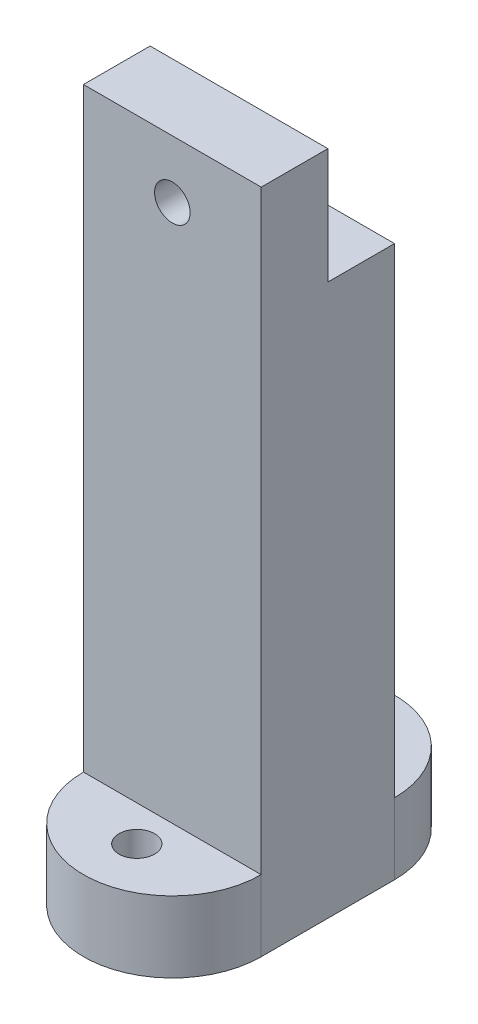
ISO-10303-21;
HEADER;
FILE_DESCRIPTION(('STEP AP214'),'2;1');
FILE_NAME('part.step','',(''),(''),'','','');
FILE_SCHEMA(('AUTOMOTIVE_DESIGN { 1 0 10303 214 1 1 1 1 }'));
ENDSEC;
DATA;
#1=APPLICATION_CONTEXT('core data for automotive mechanical design processes');
#2=APPLICATION_PROTOCOL_DEFINITION('international standard','automotive_design',2000,#1);
#3=PRODUCT_CONTEXT('',#1,'mechanical');
#4=PRODUCT('Part','Part','',(#3));
#5=PRODUCT_RELATED_PRODUCT_CATEGORY('part','',(#4));
#6=PRODUCT_DEFINITION_FORMATION('','',#4);
#7=PRODUCT_DEFINITION_CONTEXT('part definition',#1,'design');
#8=PRODUCT_DEFINITION('design','',#6,#7);
#9=PRODUCT_DEFINITION_SHAPE('','',#8);
#10=(LENGTH_UNIT() NAMED_UNIT(*) SI_UNIT(.MILLI.,.METRE.));
#11=(NAMED_UNIT(*) PLANE_ANGLE_UNIT() SI_UNIT($,.RADIAN.));
#12=(NAMED_UNIT(*) SI_UNIT($,.STERADIAN.) SOLID_ANGLE_UNIT());
#13=UNCERTAINTY_MEASURE_WITH_UNIT(LENGTH_MEASURE(1.E-05),#10,'distance_accuracy_value','');
#14=(GEOMETRIC_REPRESENTATION_CONTEXT(3) GLOBAL_UNCERTAINTY_ASSIGNED_CONTEXT((#13)) GLOBAL_UNIT_ASSIGNED_CONTEXT((#10,
#11,#12)) REPRESENTATION_CONTEXT('',''));
#15=CARTESIAN_POINT('',(0.,0.,0.));
#16=DIRECTION('',(0.,0.,1.));
#17=DIRECTION('',(1.,0.,0.));
#18=AXIS2_PLACEMENT_3D('',#15,#16,#17);
#19=CARTESIAN_POINT('',(0.,0.,0.));
#20=DIRECTION('',(0.,0.,1.));
#21=DIRECTION('',(1.,0.,0.));
#22=AXIS2_PLACEMENT_3D('',#19,#20,#21);
#23=PLANE('',#22);
#24=DIRECTION('',(0.,-1.,0.));
#25=VECTOR('',#24,1.);
#26=CARTESIAN_POINT('',(-10.,37.5,0.));
#27=LINE('',#26,#25);
#28=CARTESIAN_POINT('',(-10.,24.5,0.));
#29=VERTEX_POINT('',#28);
#30=CARTESIAN_POINT('',(-10.,-29.5,0.));
#31=VERTEX_POINT('',#30);
#32=EDGE_CURVE('E125',#29,#31,#27,.T.);
#33=ORIENTED_EDGE('',*,*,#32,.F.);
#34=DIRECTION('',(-1.,0.,0.));
#35=VECTOR('',#34,1.);
#36=CARTESIAN_POINT('',(10.,24.5,0.));
#37=LINE('',#36,#35);
#38=CARTESIAN_POINT('',(10.,24.5,0.));
#39=VERTEX_POINT('',#38);
#40=EDGE_CURVE('E60',#39,#29,#37,.T.);
#41=ORIENTED_EDGE('',*,*,#40,.F.);
#42=DIRECTION('',(0.,1.,0.));
#43=VECTOR('',#42,1.);
#44=CARTESIAN_POINT('',(9.99999999999999,37.5,0.));
#45=LINE('',#44,#43);
#46=CARTESIAN_POINT('',(10.,-29.5,0.));
#47=VERTEX_POINT('',#46);
#48=EDGE_CURVE('E123',#47,#39,#45,.T.);
#49=ORIENTED_EDGE('',*,*,#48,.F.);
#50=DIRECTION('',(-1.,0.,0.));
#51=VECTOR('',#50,1.);
#52=CARTESIAN_POINT('',(-10.,-29.5,0.));
#53=LINE('',#52,#51);
#54=EDGE_CURVE('E134',#47,#31,#53,.T.);
#55=ORIENTED_EDGE('',*,*,#54,.T.);
#56=EDGE_LOOP('',(#33,#41,#49,#55));
#57=FACE_BOUND('',#56,.T.);
#58=ADVANCED_FACE('F45',(#57),#23,.F.);
#59=CARTESIAN_POINT('',(9.99999999999999,37.5,15.));
#60=DIRECTION('',(-1.,0.,0.));
#61=DIRECTION('',(0.,-1.,0.));
#62=AXIS2_PLACEMENT_3D('',#59,#60,#61);
#63=PLANE('',#62);
#64=DIRECTION('',(0.,0.,-1.));
#65=VECTOR('',#64,1.);
#66=CARTESIAN_POINT('',(10.,24.5,0.));
#67=LINE('',#66,#65);
#68=CARTESIAN_POINT('',(10.,24.5,7.5));
#69=VERTEX_POINT('',#68);
#70=EDGE_CURVE('E110',#69,#39,#67,.T.);
#71=ORIENTED_EDGE('',*,*,#70,.F.);
#72=DIRECTION('',(0.,1.,0.));
#73=VECTOR('',#72,1.);
#74=CARTESIAN_POINT('',(10.,24.5,7.5));
#75=LINE('',#74,#73);
#76=CARTESIAN_POINT('',(10.,37.5,7.5));
#77=VERTEX_POINT('',#76);
#78=EDGE_CURVE('E166',#69,#77,#75,.T.);
#79=ORIENTED_EDGE('',*,*,#78,.T.);
#80=DIRECTION('',(0.,0.,-1.));
#81=VECTOR('',#80,1.);
#82=CARTESIAN_POINT('',(9.99999999999999,37.5,15.));
#83=LINE('',#82,#81);
#84=CARTESIAN_POINT('',(9.99999999999999,37.5,15.));
#85=VERTEX_POINT('',#84);
#86=EDGE_CURVE('E13',#85,#77,#83,.T.);
#87=ORIENTED_EDGE('',*,*,#86,.F.);
#88=DIRECTION('',(0.,1.,0.));
#89=VECTOR('',#88,1.);
#90=CARTESIAN_POINT('',(9.99999999999999,37.5,15.));
#91=LINE('',#90,#89);
#92=CARTESIAN_POINT('',(10.,-29.5,15.));
#93=VERTEX_POINT('',#92);
#94=EDGE_CURVE('E141',#93,#85,#91,.T.);
#95=ORIENTED_EDGE('',*,*,#94,.F.);
#96=CARTESIAN_POINT('',(10.,-37.5,15.));
#97=VERTEX_POINT('',#96);
#98=EDGE_CURVE('E195',#97,#93,#91,.T.);
#99=ORIENTED_EDGE('',*,*,#98,.F.);
#100=DIRECTION('',(0.,0.,-1.));
#101=VECTOR('',#100,1.);
#102=CARTESIAN_POINT('',(10.,-37.5,15.));
#103=LINE('',#102,#101);
#104=CARTESIAN_POINT('',(10.,-37.5,0.));
#105=VERTEX_POINT('',#104);
#106=EDGE_CURVE('E142',#97,#105,#103,.T.);
#107=ORIENTED_EDGE('',*,*,#106,.T.);
#108=EDGE_CURVE('E130',#105,#47,#45,.T.);
#109=ORIENTED_EDGE('',*,*,#108,.T.);
#110=ORIENTED_EDGE('',*,*,#48,.T.);
#111=EDGE_LOOP('',(#71,#79,#87,#95,#99,#107,#109,#110));
#112=FACE_BOUND('',#111,.T.);
#113=ADVANCED_FACE('F47',(#112),#63,.F.);
#114=CARTESIAN_POINT('',(-10.,37.5,15.));
#115=DIRECTION('',(0.,-1.,0.));
#116=DIRECTION('',(0.,0.,-1.));
#117=AXIS2_PLACEMENT_3D('',#114,#115,#116);
#118=PLANE('',#117);
#119=ORIENTED_EDGE('',*,*,#86,.T.);
#120=DIRECTION('',(1.,0.,0.));
#121=VECTOR('',#120,1.);
#122=CARTESIAN_POINT('',(10.,37.5,7.5));
#123=LINE('',#122,#121);
#124=CARTESIAN_POINT('',(-10.,37.5,7.5));
#125=VERTEX_POINT('',#124);
#126=EDGE_CURVE('E117',#125,#77,#123,.T.);
#127=ORIENTED_EDGE('',*,*,#126,.F.);
#128=DIRECTION('',(0.,0.,-1.));
#129=VECTOR('',#128,1.);
#130=CARTESIAN_POINT('',(-10.,37.5,15.));
#131=LINE('',#130,#129);
#132=CARTESIAN_POINT('',(-10.,37.5,15.));
#133=VERTEX_POINT('',#132);
#134=EDGE_CURVE('E53',#133,#125,#131,.T.);
#135=ORIENTED_EDGE('',*,*,#134,.F.);
#136=DIRECTION('',(-1.,0.,0.));
#137=VECTOR('',#136,1.);
#138=CARTESIAN_POINT('',(-10.,37.5,15.));
#139=LINE('',#138,#137);
#140=EDGE_CURVE('E155',#85,#133,#139,.T.);
#141=ORIENTED_EDGE('',*,*,#140,.F.);
#142=EDGE_LOOP('',(#119,#127,#135,#141));
#143=FACE_BOUND('',#142,.T.);
#144=ADVANCED_FACE('F154',(#143),#118,.F.);
#145=CARTESIAN_POINT('',(-10.,37.5,15.));
#146=DIRECTION('',(1.,0.,0.));
#147=DIRECTION('',(0.,1.,0.));
#148=AXIS2_PLACEMENT_3D('',#145,#146,#147);
#149=PLANE('',#148);
#150=ORIENTED_EDGE('',*,*,#134,.T.);
#151=DIRECTION('',(0.,1.,0.));
#152=VECTOR('',#151,1.);
#153=CARTESIAN_POINT('',(-10.,24.5,7.5));
#154=LINE('',#153,#152);
#155=CARTESIAN_POINT('',(-10.,24.5,7.5));
#156=VERTEX_POINT('',#155);
#157=EDGE_CURVE('E150',#156,#125,#154,.T.);
#158=ORIENTED_EDGE('',*,*,#157,.F.);
#159=DIRECTION('',(0.,0.,1.));
#160=VECTOR('',#159,1.);
#161=CARTESIAN_POINT('',(-10.,24.5,0.));
#162=LINE('',#161,#160);
#163=EDGE_CURVE('E126',#29,#156,#162,.T.);
#164=ORIENTED_EDGE('',*,*,#163,.F.);
#165=ORIENTED_EDGE('',*,*,#32,.T.);
#166=DIRECTION('',(0.,-1.,0.));
#167=VECTOR('',#166,1.);
#168=CARTESIAN_POINT('',(-10.,-29.5,0.));
#169=LINE('',#168,#167);
#170=CARTESIAN_POINT('',(-10.,-37.5,0.));
#171=VERTEX_POINT('',#170);
#172=EDGE_CURVE('E131',#31,#171,#169,.T.);
#173=ORIENTED_EDGE('',*,*,#172,.T.);
#174=DIRECTION('',(0.,0.,-1.));
#175=VECTOR('',#174,1.);
#176=CARTESIAN_POINT('',(-10.,-37.5,15.));
#177=LINE('',#176,#175);
#178=CARTESIAN_POINT('',(-10.,-37.5,15.));
#179=VERTEX_POINT('',#178);
#180=EDGE_CURVE('E144',#179,#171,#177,.T.);
#181=ORIENTED_EDGE('',*,*,#180,.F.);
#182=DIRECTION('',(0.,-1.,0.));
#183=VECTOR('',#182,1.);
#184=CARTESIAN_POINT('',(-10.,-29.5,15.));
#185=LINE('',#184,#183);
#186=CARTESIAN_POINT('',(-10.,-29.5,15.));
#187=VERTEX_POINT('',#186);
#188=EDGE_CURVE('E68',#187,#179,#185,.T.);
#189=ORIENTED_EDGE('',*,*,#188,.F.);
#190=DIRECTION('',(0.,-1.,0.));
#191=VECTOR('',#190,1.);
#192=CARTESIAN_POINT('',(-10.,37.5,15.));
#193=LINE('',#192,#191);
#194=EDGE_CURVE('E138',#133,#187,#193,.T.);
#195=ORIENTED_EDGE('',*,*,#194,.F.);
#196=EDGE_LOOP('',(#150,#158,#164,#165,#173,#181,#189,#195));
#197=FACE_BOUND('',#196,.T.);
#198=ADVANCED_FACE('F149',(#197),#149,.F.);
#199=CARTESIAN_POINT('',(-10.,-37.5,15.));
#200=DIRECTION('',(0.,1.,0.));
#201=DIRECTION('',(0.,0.,1.));
#202=AXIS2_PLACEMENT_3D('',#199,#200,#201);
#203=PLANE('',#202);
#204=ORIENTED_EDGE('',*,*,#180,.T.);
#205=CARTESIAN_POINT('',(0.,-37.5,0.));
#206=DIRECTION('',(0.,-1.,0.));
#207=DIRECTION('',(0.,0.,-1.));
#208=AXIS2_PLACEMENT_3D('',#205,#206,#207);
#209=CIRCLE('',#208,10.);
#210=EDGE_CURVE('E188',#171,#105,#209,.T.);
#211=ORIENTED_EDGE('',*,*,#210,.T.);
#212=ORIENTED_EDGE('',*,*,#106,.F.);
#213=CARTESIAN_POINT('',(0.,-37.5,15.));
#214=DIRECTION('',(0.,-1.,0.));
#215=DIRECTION('',(0.,0.,1.));
#216=AXIS2_PLACEMENT_3D('',#213,#214,#215);
#217=CIRCLE('',#216,10.);
#218=EDGE_CURVE('E173',#97,#179,#217,.T.);
#219=ORIENTED_EDGE('',*,*,#218,.T.);
#220=EDGE_LOOP('',(#204,#211,#212,#219));
#221=FACE_BOUND('',#220,.T.);
#222=CARTESIAN_POINT('',(0.,-37.5,-4.));
#223=DIRECTION('',(0.,-1.,0.));
#224=DIRECTION('',(0.,0.,-1.));
#225=AXIS2_PLACEMENT_3D('',#222,#223,#224);
#226=CIRCLE('',#225,2.);
#227=CARTESIAN_POINT('',(0.,-37.5,-6.));
#228=VERTEX_POINT('',#227);
#229=EDGE_CURVE('E184',#228,#228,#226,.T.);
#230=ORIENTED_EDGE('',*,*,#229,.F.);
#231=EDGE_LOOP('',(#230));
#232=FACE_BOUND('',#231,.T.);
#233=CARTESIAN_POINT('',(0.,-37.5,19.));
#234=DIRECTION('',(0.,-1.,0.));
#235=DIRECTION('',(0.,0.,1.));
#236=AXIS2_PLACEMENT_3D('',#233,#234,#235);
#237=CIRCLE('',#236,2.);
#238=CARTESIAN_POINT('',(0.,-37.5,21.));
#239=VERTEX_POINT('',#238);
#240=EDGE_CURVE('E168',#239,#239,#237,.T.);
#241=ORIENTED_EDGE('',*,*,#240,.F.);
#242=EDGE_LOOP('',(#241));
#243=FACE_BOUND('',#242,.T.);
#244=ADVANCED_FACE('F228',(#221,#232,#243),#203,.F.);
#245=CARTESIAN_POINT('',(0.,0.,15.));
#246=DIRECTION('',(0.,0.,1.));
#247=DIRECTION('',(1.,0.,0.));
#248=AXIS2_PLACEMENT_3D('',#245,#246,#247);
#249=PLANE('',#248);
#250=CARTESIAN_POINT('',(0.,31.,15.));
#251=DIRECTION('',(0.,0.,1.));
#252=DIRECTION('',(1.,0.,0.));
#253=AXIS2_PLACEMENT_3D('',#250,#251,#252);
#254=CIRCLE('',#253,2.);
#255=CARTESIAN_POINT('',(2.,31.,15.));
#256=VERTEX_POINT('',#255);
#257=EDGE_CURVE('E158',#256,#256,#254,.T.);
#258=ORIENTED_EDGE('',*,*,#257,.F.);
#259=EDGE_LOOP('',(#258));
#260=FACE_BOUND('',#259,.T.);
#261=DIRECTION('',(1.,0.,0.));
#262=VECTOR('',#261,1.);
#263=CARTESIAN_POINT('',(-10.,-29.5,15.));
#264=LINE('',#263,#262);
#265=EDGE_CURVE('E179',#187,#93,#264,.T.);
#266=ORIENTED_EDGE('',*,*,#265,.T.);
#267=ORIENTED_EDGE('',*,*,#94,.T.);
#268=ORIENTED_EDGE('',*,*,#140,.T.);
#269=ORIENTED_EDGE('',*,*,#194,.T.);
#270=EDGE_LOOP('',(#266,#267,#268,#269));
#271=FACE_BOUND('',#270,.T.);
#272=ADVANCED_FACE('F198',(#260,#271),#249,.T.);
#273=CARTESIAN_POINT('',(0.,-29.5,0.));
#274=DIRECTION('',(0.,-1.,0.));
#275=DIRECTION('',(0.,0.,-1.));
#276=AXIS2_PLACEMENT_3D('',#273,#274,#275);
#277=CYLINDRICAL_SURFACE('',#276,10.);
#278=ORIENTED_EDGE('',*,*,#210,.F.);
#279=ORIENTED_EDGE('',*,*,#172,.F.);
#280=CARTESIAN_POINT('',(0.,-29.5,0.));
#281=DIRECTION('',(0.,-1.,0.));
#282=DIRECTION('',(0.,0.,-1.));
#283=AXIS2_PLACEMENT_3D('',#280,#281,#282);
#284=CIRCLE('',#283,10.);
#285=EDGE_CURVE('E191',#31,#47,#284,.T.);
#286=ORIENTED_EDGE('',*,*,#285,.T.);
#287=ORIENTED_EDGE('',*,*,#108,.F.);
#288=EDGE_LOOP('',(#278,#279,#286,#287));
#289=FACE_BOUND('',#288,.T.);
#290=ADVANCED_FACE('F254',(#289),#277,.T.);
#291=CARTESIAN_POINT('',(0.,-29.5,0.));
#292=DIRECTION('',(0.,-1.,0.));
#293=DIRECTION('',(0.,0.,-1.));
#294=AXIS2_PLACEMENT_3D('',#291,#292,#293);
#295=PLANE('',#294);
#296=CARTESIAN_POINT('',(0.,-29.5,-4.));
#297=DIRECTION('',(0.,-1.,0.));
#298=DIRECTION('',(0.,0.,-1.));
#299=AXIS2_PLACEMENT_3D('',#296,#297,#298);
#300=CIRCLE('',#299,2.);
#301=CARTESIAN_POINT('',(0.,-29.5,-6.));
#302=VERTEX_POINT('',#301);
#303=EDGE_CURVE('E185',#302,#302,#300,.T.);
#304=ORIENTED_EDGE('',*,*,#303,.T.);
#305=EDGE_LOOP('',(#304));
#306=FACE_BOUND('',#305,.T.);
#307=ORIENTED_EDGE('',*,*,#285,.F.);
#308=ORIENTED_EDGE('',*,*,#54,.F.);
#309=EDGE_LOOP('',(#307,#308));
#310=FACE_BOUND('',#309,.T.);
#311=ADVANCED_FACE('F261',(#306,#310),#295,.F.);
#312=CARTESIAN_POINT('',(0.,-29.5,-4.));
#313=DIRECTION('',(0.,-1.,0.));
#314=DIRECTION('',(0.,0.,-1.));
#315=AXIS2_PLACEMENT_3D('',#312,#313,#314);
#316=CYLINDRICAL_SURFACE('',#315,2.);
#317=ORIENTED_EDGE('',*,*,#303,.F.);
#318=EDGE_LOOP('',(#317));
#319=FACE_BOUND('',#318,.T.);
#320=ORIENTED_EDGE('',*,*,#229,.T.);
#321=EDGE_LOOP('',(#320));
#322=FACE_BOUND('',#321,.T.);
#323=ADVANCED_FACE('F218',(#319,#322),#316,.F.);
#324=CARTESIAN_POINT('',(0.,-29.5,15.));
#325=DIRECTION('',(0.,-1.,0.));
#326=DIRECTION('',(0.,0.,-1.));
#327=AXIS2_PLACEMENT_3D('',#324,#325,#326);
#328=CYLINDRICAL_SURFACE('',#327,10.);
#329=ORIENTED_EDGE('',*,*,#218,.F.);
#330=ORIENTED_EDGE('',*,*,#98,.T.);
#331=CARTESIAN_POINT('',(0.,-29.5,15.));
#332=DIRECTION('',(0.,-1.,0.));
#333=DIRECTION('',(0.,0.,1.));
#334=AXIS2_PLACEMENT_3D('',#331,#332,#333);
#335=CIRCLE('',#334,10.);
#336=EDGE_CURVE('E176',#93,#187,#335,.T.);
#337=ORIENTED_EDGE('',*,*,#336,.T.);
#338=ORIENTED_EDGE('',*,*,#188,.T.);
#339=EDGE_LOOP('',(#329,#330,#337,#338));
#340=FACE_BOUND('',#339,.T.);
#341=ADVANCED_FACE('F204',(#340),#328,.T.);
#342=CARTESIAN_POINT('',(0.,-29.5,15.));
#343=DIRECTION('',(0.,1.,0.));
#344=DIRECTION('',(0.,0.,1.));
#345=AXIS2_PLACEMENT_3D('',#342,#343,#344);
#346=PLANE('',#345);
#347=CARTESIAN_POINT('',(0.,-29.5,19.));
#348=DIRECTION('',(0.,-1.,0.));
#349=DIRECTION('',(0.,0.,1.));
#350=AXIS2_PLACEMENT_3D('',#347,#348,#349);
#351=CIRCLE('',#350,2.);
#352=CARTESIAN_POINT('',(0.,-29.5,21.));
#353=VERTEX_POINT('',#352);
#354=EDGE_CURVE('E170',#353,#353,#351,.T.);
#355=ORIENTED_EDGE('',*,*,#354,.T.);
#356=EDGE_LOOP('',(#355));
#357=FACE_BOUND('',#356,.T.);
#358=ORIENTED_EDGE('',*,*,#336,.F.);
#359=ORIENTED_EDGE('',*,*,#265,.F.);
#360=EDGE_LOOP('',(#358,#359));
#361=FACE_BOUND('',#360,.T.);
#362=ADVANCED_FACE('F206',(#357,#361),#346,.T.);
#363=CARTESIAN_POINT('',(0.,-29.5,19.));
#364=DIRECTION('',(0.,-1.,0.));
#365=DIRECTION('',(0.,0.,-1.));
#366=AXIS2_PLACEMENT_3D('',#363,#364,#365);
#367=CYLINDRICAL_SURFACE('',#366,2.);
#368=ORIENTED_EDGE('',*,*,#354,.F.);
#369=EDGE_LOOP('',(#368));
#370=FACE_BOUND('',#369,.T.);
#371=ORIENTED_EDGE('',*,*,#240,.T.);
#372=EDGE_LOOP('',(#371));
#373=FACE_BOUND('',#372,.T.);
#374=ADVANCED_FACE('F208',(#370,#373),#367,.F.);
#375=CARTESIAN_POINT('',(10.,24.5,7.5));
#376=DIRECTION('',(0.,0.,1.));
#377=DIRECTION('',(1.,0.,0.));
#378=AXIS2_PLACEMENT_3D('',#375,#376,#377);
#379=PLANE('',#378);
#380=CARTESIAN_POINT('',(0.,31.,7.5));
#381=DIRECTION('',(0.,0.,-1.));
#382=DIRECTION('',(-1.,0.,0.));
#383=AXIS2_PLACEMENT_3D('',#380,#381,#382);
#384=CIRCLE('',#383,2.);
#385=CARTESIAN_POINT('',(-2.,31.,7.5));
#386=VERTEX_POINT('',#385);
#387=EDGE_CURVE('E161',#386,#386,#384,.T.);
#388=ORIENTED_EDGE('',*,*,#387,.F.);
#389=EDGE_LOOP('',(#388));
#390=FACE_BOUND('',#389,.T.);
#391=ORIENTED_EDGE('',*,*,#126,.T.);
#392=ORIENTED_EDGE('',*,*,#78,.F.);
#393=DIRECTION('',(1.,0.,0.));
#394=VECTOR('',#393,1.);
#395=CARTESIAN_POINT('',(10.,24.5,7.5));
#396=LINE('',#395,#394);
#397=EDGE_CURVE('E113',#156,#69,#396,.T.);
#398=ORIENTED_EDGE('',*,*,#397,.F.);
#399=ORIENTED_EDGE('',*,*,#157,.T.);
#400=EDGE_LOOP('',(#391,#392,#398,#399));
#401=FACE_BOUND('',#400,.T.);
#402=ADVANCED_FACE('F215',(#390,#401),#379,.F.);
#403=CARTESIAN_POINT('',(0.,24.5,0.));
#404=DIRECTION('',(0.,-1.,0.));
#405=DIRECTION('',(0.,0.,-1.));
#406=AXIS2_PLACEMENT_3D('',#403,#404,#405);
#407=PLANE('',#406);
#408=ORIENTED_EDGE('',*,*,#70,.T.);
#409=ORIENTED_EDGE('',*,*,#40,.T.);
#410=ORIENTED_EDGE('',*,*,#163,.T.);
#411=ORIENTED_EDGE('',*,*,#397,.T.);
#412=EDGE_LOOP('',(#408,#409,#410,#411));
#413=FACE_BOUND('',#412,.T.);
#414=ADVANCED_FACE('F111',(#413),#407,.F.);
#415=CARTESIAN_POINT('',(0.,31.,20.5));
#416=DIRECTION('',(0.,0.,-1.));
#417=DIRECTION('',(-1.,0.,0.));
#418=AXIS2_PLACEMENT_3D('',#415,#416,#417);
#419=CYLINDRICAL_SURFACE('',#418,2.);
#420=ORIENTED_EDGE('',*,*,#257,.T.);
#421=EDGE_LOOP('',(#420));
#422=FACE_BOUND('',#421,.T.);
#423=ORIENTED_EDGE('',*,*,#387,.T.);
#424=EDGE_LOOP('',(#423));
#425=FACE_BOUND('',#424,.T.);
#426=ADVANCED_FACE('F332',(#422,#425),#419,.F.);
#427=CLOSED_SHELL('',(#58,#113,#144,#198,#244,#272,#290,#311,#323,#341,#362,#374,#402,#414,#426));
#428=MANIFOLD_SOLID_BREP('B2',#427);
#429=ADVANCED_BREP_SHAPE_REPRESENTATION('',(#18,#428),#14);
#430=SHAPE_DEFINITION_REPRESENTATION(#9,#429);
ENDSEC;
END-ISO-10303-21;
